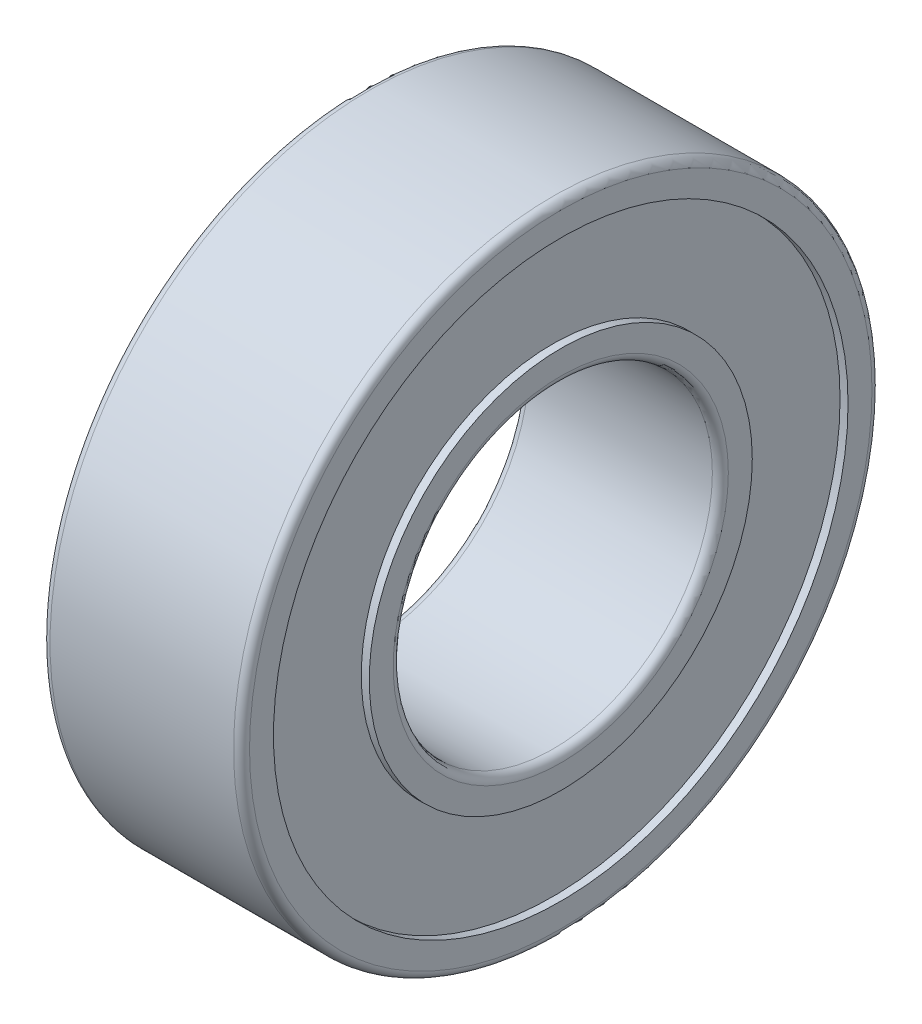
ISO-10303-21;
HEADER;
FILE_DESCRIPTION(('STEP AP214'),'2;1');
FILE_NAME('part.step','',(''),(''),'','','');
FILE_SCHEMA(('AUTOMOTIVE_DESIGN { 1 0 10303 214 1 1 1 1 }'));
ENDSEC;
DATA;
#1=APPLICATION_CONTEXT('core data for automotive mechanical design processes');
#2=APPLICATION_PROTOCOL_DEFINITION('international standard','automotive_design',2000,#1);
#3=PRODUCT_CONTEXT('',#1,'mechanical');
#4=PRODUCT('Part','Part','',(#3));
#5=PRODUCT_RELATED_PRODUCT_CATEGORY('part','',(#4));
#6=PRODUCT_DEFINITION_FORMATION('','',#4);
#7=PRODUCT_DEFINITION_CONTEXT('part definition',#1,'design');
#8=PRODUCT_DEFINITION('design','',#6,#7);
#9=PRODUCT_DEFINITION_SHAPE('','',#8);
#10=(LENGTH_UNIT() NAMED_UNIT(*) SI_UNIT(.MILLI.,.METRE.));
#11=(NAMED_UNIT(*) PLANE_ANGLE_UNIT() SI_UNIT($,.RADIAN.));
#12=(NAMED_UNIT(*) SI_UNIT($,.STERADIAN.) SOLID_ANGLE_UNIT());
#13=UNCERTAINTY_MEASURE_WITH_UNIT(LENGTH_MEASURE(1.E-05),#10,'distance_accuracy_value','');
#14=(GEOMETRIC_REPRESENTATION_CONTEXT(3) GLOBAL_UNCERTAINTY_ASSIGNED_CONTEXT((#13)) GLOBAL_UNIT_ASSIGNED_CONTEXT((#10,
#11,#12)) REPRESENTATION_CONTEXT('',''));
#15=CARTESIAN_POINT('',(0.,0.,0.));
#16=DIRECTION('',(0.,0.,1.));
#17=DIRECTION('',(1.,0.,0.));
#18=AXIS2_PLACEMENT_3D('',#15,#16,#17);
#19=CARTESIAN_POINT('',(50.,0.,0.));
#20=DIRECTION('',(1.,0.,0.));
#21=DIRECTION('',(0.,0.,-1.));
#22=AXIS2_PLACEMENT_3D('',#19,#20,#21);
#23=CYLINDRICAL_SURFACE('',#22,7.2);
#24=CARTESIAN_POINT('',(-4.8,0.,0.));
#25=DIRECTION('',(-1.,0.,0.));
#26=DIRECTION('',(0.,0.,1.));
#27=AXIS2_PLACEMENT_3D('',#24,#25,#26);
#28=CIRCLE('',#27,7.2);
#29=CARTESIAN_POINT('',(-4.8,0.,7.2));
#30=VERTEX_POINT('',#29);
#31=EDGE_CURVE('E5',#30,#30,#28,.T.);
#32=ORIENTED_EDGE('',*,*,#31,.F.);
#33=EDGE_LOOP('',(#32));
#34=FACE_BOUND('',#33,.T.);
#35=CARTESIAN_POINT('',(-5.,0.,0.));
#36=DIRECTION('',(1.,0.,0.));
#37=DIRECTION('',(0.,0.,-1.));
#38=AXIS2_PLACEMENT_3D('',#35,#36,#37);
#39=CIRCLE('',#38,7.2);
#40=CARTESIAN_POINT('',(-5.,0.,-7.2));
#41=VERTEX_POINT('',#40);
#42=EDGE_CURVE('E9',#41,#41,#39,.T.);
#43=ORIENTED_EDGE('',*,*,#42,.F.);
#44=EDGE_LOOP('',(#43));
#45=FACE_BOUND('',#44,.T.);
#46=ADVANCED_FACE('F13',(#34,#45),#23,.F.);
#47=CARTESIAN_POINT('',(50.,0.,0.));
#48=DIRECTION('',(1.,0.,0.));
#49=DIRECTION('',(0.,0.,-1.));
#50=AXIS2_PLACEMENT_3D('',#47,#48,#49);
#51=CYLINDRICAL_SURFACE('',#50,4.8);
#52=CARTESIAN_POINT('',(-4.8,0.,0.));
#53=DIRECTION('',(1.,0.,0.));
#54=DIRECTION('',(0.,0.,1.));
#55=AXIS2_PLACEMENT_3D('',#52,#53,#54);
#56=CIRCLE('',#55,4.8);
#57=CARTESIAN_POINT('',(-4.8,0.,4.8));
#58=VERTEX_POINT('',#57);
#59=EDGE_CURVE('E24',#58,#58,#56,.T.);
#60=ORIENTED_EDGE('',*,*,#59,.F.);
#61=EDGE_LOOP('',(#60));
#62=FACE_BOUND('',#61,.T.);
#63=CARTESIAN_POINT('',(-5.,0.,0.));
#64=DIRECTION('',(1.,0.,0.));
#65=DIRECTION('',(0.,0.,-1.));
#66=AXIS2_PLACEMENT_3D('',#63,#64,#65);
#67=CIRCLE('',#66,4.8);
#68=CARTESIAN_POINT('',(-5.,0.,-4.8));
#69=VERTEX_POINT('',#68);
#70=EDGE_CURVE('E28',#69,#69,#67,.T.);
#71=ORIENTED_EDGE('',*,*,#70,.T.);
#72=EDGE_LOOP('',(#71));
#73=FACE_BOUND('',#72,.T.);
#74=ADVANCED_FACE('F32',(#62,#73),#51,.T.);
#75=CARTESIAN_POINT('',(-5.,7.8,0.));
#76=DIRECTION('',(-1.,0.,0.));
#77=DIRECTION('',(0.,0.,1.));
#78=AXIS2_PLACEMENT_3D('',#75,#76,#77);
#79=PLANE('',#78);
#80=ORIENTED_EDGE('',*,*,#42,.T.);
#81=EDGE_LOOP('',(#80));
#82=FACE_BOUND('',#81,.T.);
#83=CARTESIAN_POINT('',(-5.,0.,0.));
#84=DIRECTION('',(1.,0.,0.));
#85=DIRECTION('',(0.,0.,-1.));
#86=AXIS2_PLACEMENT_3D('',#83,#84,#85);
#87=CIRCLE('',#86,7.7999998908242);
#88=CARTESIAN_POINT('',(-5.,0.,-7.7999998908242));
#89=VERTEX_POINT('',#88);
#90=EDGE_CURVE('E41',#89,#89,#87,.T.);
#91=ORIENTED_EDGE('',*,*,#90,.F.);
#92=EDGE_LOOP('',(#91));
#93=FACE_BOUND('',#92,.T.);
#94=ADVANCED_FACE('F45',(#82,#93),#79,.T.);
#95=CARTESIAN_POINT('',(-5.,4.8,0.));
#96=DIRECTION('',(-1.,0.,0.));
#97=DIRECTION('',(0.,0.,1.));
#98=AXIS2_PLACEMENT_3D('',#95,#96,#97);
#99=PLANE('',#98);
#100=CARTESIAN_POINT('',(-5.,0.,0.));
#101=DIRECTION('',(1.,0.,0.));
#102=DIRECTION('',(0.,0.,-1.));
#103=AXIS2_PLACEMENT_3D('',#100,#101,#102);
#104=CIRCLE('',#103,4.19999988900885);
#105=CARTESIAN_POINT('',(-5.,0.,-4.19999988900885));
#106=VERTEX_POINT('',#105);
#107=EDGE_CURVE('E52',#106,#106,#104,.T.);
#108=ORIENTED_EDGE('',*,*,#107,.T.);
#109=EDGE_LOOP('',(#108));
#110=FACE_BOUND('',#109,.T.);
#111=ORIENTED_EDGE('',*,*,#70,.F.);
#112=EDGE_LOOP('',(#111));
#113=FACE_BOUND('',#112,.T.);
#114=ADVANCED_FACE('F58',(#110,#113),#99,.T.);
#115=CARTESIAN_POINT('',(-4.8,0.,0.));
#116=DIRECTION('',(1.,0.,0.));
#117=DIRECTION('',(0.,0.,-1.));
#118=AXIS2_PLACEMENT_3D('',#115,#116,#117);
#119=TOROIDAL_SURFACE('',#118,4.2,0.200000000000031);
#120=CARTESIAN_POINT('',(-4.8,0.,0.));
#121=DIRECTION('',(1.,0.,0.));
#122=DIRECTION('',(0.,0.,-1.));
#123=AXIS2_PLACEMENT_3D('',#120,#121,#122);
#124=CIRCLE('',#123,4.);
#125=CARTESIAN_POINT('',(-4.8,0.,-4.));
#126=VERTEX_POINT('',#125);
#127=EDGE_CURVE('E65',#126,#126,#124,.T.);
#128=ORIENTED_EDGE('',*,*,#127,.T.);
#129=EDGE_LOOP('',(#128));
#130=FACE_BOUND('',#129,.T.);
#131=ORIENTED_EDGE('',*,*,#107,.F.);
#132=EDGE_LOOP('',(#131));
#133=FACE_BOUND('',#132,.T.);
#134=ADVANCED_FACE('F71',(#130,#133),#119,.T.);
#135=CARTESIAN_POINT('',(50.,0.,0.));
#136=DIRECTION('',(1.,0.,0.));
#137=DIRECTION('',(0.,0.,-1.));
#138=AXIS2_PLACEMENT_3D('',#135,#136,#137);
#139=CYLINDRICAL_SURFACE('',#138,4.);
#140=CARTESIAN_POINT('',(-0.200000000000003,0.,0.));
#141=DIRECTION('',(1.,0.,0.));
#142=DIRECTION('',(0.,0.,-1.));
#143=AXIS2_PLACEMENT_3D('',#140,#141,#142);
#144=CIRCLE('',#143,4.);
#145=CARTESIAN_POINT('',(-0.200000000000003,0.,-4.));
#146=VERTEX_POINT('',#145);
#147=EDGE_CURVE('E78',#146,#146,#144,.T.);
#148=ORIENTED_EDGE('',*,*,#147,.T.);
#149=EDGE_LOOP('',(#148));
#150=FACE_BOUND('',#149,.T.);
#151=ORIENTED_EDGE('',*,*,#127,.F.);
#152=EDGE_LOOP('',(#151));
#153=FACE_BOUND('',#152,.T.);
#154=ADVANCED_FACE('F84',(#150,#153),#139,.F.);
#155=CARTESIAN_POINT('',(-0.200000000000016,0.,0.));
#156=DIRECTION('',(1.,0.,0.));
#157=DIRECTION('',(0.,0.,-1.));
#158=AXIS2_PLACEMENT_3D('',#155,#156,#157);
#159=TOROIDAL_SURFACE('',#158,4.2,0.200000000000016);
#160=CARTESIAN_POINT('',(0.,0.,0.));
#161=DIRECTION('',(1.,0.,0.));
#162=DIRECTION('',(0.,0.,-1.));
#163=AXIS2_PLACEMENT_3D('',#160,#161,#162);
#164=CIRCLE('',#163,4.2);
#165=CARTESIAN_POINT('',(0.,0.,-4.2));
#166=VERTEX_POINT('',#165);
#167=EDGE_CURVE('E91',#166,#166,#164,.T.);
#168=ORIENTED_EDGE('',*,*,#167,.T.);
#169=EDGE_LOOP('',(#168));
#170=FACE_BOUND('',#169,.T.);
#171=ORIENTED_EDGE('',*,*,#147,.F.);
#172=EDGE_LOOP('',(#171));
#173=FACE_BOUND('',#172,.T.);
#174=ADVANCED_FACE('F97',(#170,#173),#159,.T.);
#175=CARTESIAN_POINT('',(0.,4.2,0.));
#176=DIRECTION('',(1.,0.,0.));
#177=DIRECTION('',(0.,0.,-1.));
#178=AXIS2_PLACEMENT_3D('',#175,#176,#177);
#179=PLANE('',#178);
#180=CARTESIAN_POINT('',(0.,0.,0.));
#181=DIRECTION('',(1.,0.,0.));
#182=DIRECTION('',(0.,0.,-1.));
#183=AXIS2_PLACEMENT_3D('',#180,#181,#182);
#184=CIRCLE('',#183,4.8);
#185=CARTESIAN_POINT('',(0.,0.,-4.8));
#186=VERTEX_POINT('',#185);
#187=EDGE_CURVE('E104',#186,#186,#184,.T.);
#188=ORIENTED_EDGE('',*,*,#187,.T.);
#189=EDGE_LOOP('',(#188));
#190=FACE_BOUND('',#189,.T.);
#191=ORIENTED_EDGE('',*,*,#167,.F.);
#192=EDGE_LOOP('',(#191));
#193=FACE_BOUND('',#192,.T.);
#194=ADVANCED_FACE('F110',(#190,#193),#179,.T.);
#195=CARTESIAN_POINT('',(50.,0.,0.));
#196=DIRECTION('',(1.,0.,0.));
#197=DIRECTION('',(0.,0.,-1.));
#198=AXIS2_PLACEMENT_3D('',#195,#196,#197);
#199=CYLINDRICAL_SURFACE('',#198,4.8);
#200=CARTESIAN_POINT('',(-0.200000000000003,0.,0.));
#201=DIRECTION('',(-1.,0.,0.));
#202=DIRECTION('',(0.,0.,-1.));
#203=AXIS2_PLACEMENT_3D('',#200,#201,#202);
#204=CIRCLE('',#203,4.8);
#205=CARTESIAN_POINT('',(-0.200000000000003,0.,-4.8));
#206=VERTEX_POINT('',#205);
#207=EDGE_CURVE('E117',#206,#206,#204,.T.);
#208=ORIENTED_EDGE('',*,*,#207,.F.);
#209=EDGE_LOOP('',(#208));
#210=FACE_BOUND('',#209,.T.);
#211=ORIENTED_EDGE('',*,*,#187,.F.);
#212=EDGE_LOOP('',(#211));
#213=FACE_BOUND('',#212,.T.);
#214=ADVANCED_FACE('F123',(#210,#213),#199,.T.);
#215=CARTESIAN_POINT('',(50.,0.,0.));
#216=DIRECTION('',(1.,0.,0.));
#217=DIRECTION('',(0.,0.,-1.));
#218=AXIS2_PLACEMENT_3D('',#215,#216,#217);
#219=CYLINDRICAL_SURFACE('',#218,7.2);
#220=CARTESIAN_POINT('',(-0.200000000000003,0.,0.));
#221=DIRECTION('',(1.,0.,0.));
#222=DIRECTION('',(0.,0.,-1.));
#223=AXIS2_PLACEMENT_3D('',#220,#221,#222);
#224=CIRCLE('',#223,7.2);
#225=CARTESIAN_POINT('',(-0.200000000000003,0.,-7.2));
#226=VERTEX_POINT('',#225);
#227=EDGE_CURVE('E130',#226,#226,#224,.T.);
#228=ORIENTED_EDGE('',*,*,#227,.F.);
#229=EDGE_LOOP('',(#228));
#230=FACE_BOUND('',#229,.T.);
#231=CARTESIAN_POINT('',(0.,0.,0.));
#232=DIRECTION('',(1.,0.,0.));
#233=DIRECTION('',(0.,0.,-1.));
#234=AXIS2_PLACEMENT_3D('',#231,#232,#233);
#235=CIRCLE('',#234,7.2);
#236=CARTESIAN_POINT('',(0.,0.,-7.2));
#237=VERTEX_POINT('',#236);
#238=EDGE_CURVE('E134',#237,#237,#235,.T.);
#239=ORIENTED_EDGE('',*,*,#238,.T.);
#240=EDGE_LOOP('',(#239));
#241=FACE_BOUND('',#240,.T.);
#242=ADVANCED_FACE('F138',(#230,#241),#219,.F.);
#243=CARTESIAN_POINT('',(0.,7.2,0.));
#244=DIRECTION('',(1.,0.,0.));
#245=DIRECTION('',(0.,0.,-1.));
#246=AXIS2_PLACEMENT_3D('',#243,#244,#245);
#247=PLANE('',#246);
#248=CARTESIAN_POINT('',(0.,0.,0.));
#249=DIRECTION('',(1.,0.,0.));
#250=DIRECTION('',(0.,0.,-1.));
#251=AXIS2_PLACEMENT_3D('',#248,#249,#250);
#252=CIRCLE('',#251,7.8);
#253=CARTESIAN_POINT('',(0.,0.,-7.8));
#254=VERTEX_POINT('',#253);
#255=EDGE_CURVE('E145',#254,#254,#252,.T.);
#256=ORIENTED_EDGE('',*,*,#255,.T.);
#257=EDGE_LOOP('',(#256));
#258=FACE_BOUND('',#257,.T.);
#259=ORIENTED_EDGE('',*,*,#238,.F.);
#260=EDGE_LOOP('',(#259));
#261=FACE_BOUND('',#260,.T.);
#262=ADVANCED_FACE('F151',(#258,#261),#247,.T.);
#263=CARTESIAN_POINT('',(-0.200000000000014,0.,0.));
#264=DIRECTION('',(1.,0.,0.));
#265=DIRECTION('',(0.,0.,-1.));
#266=AXIS2_PLACEMENT_3D('',#263,#264,#265);
#267=TOROIDAL_SURFACE('',#266,7.8,0.200000000000014);
#268=CARTESIAN_POINT('',(-0.2,0.,0.));
#269=DIRECTION('',(1.,0.,0.));
#270=DIRECTION('',(0.,0.,-1.));
#271=AXIS2_PLACEMENT_3D('',#268,#269,#270);
#272=CIRCLE('',#271,8.);
#273=CARTESIAN_POINT('',(-0.2,0.,-8.));
#274=VERTEX_POINT('',#273);
#275=EDGE_CURVE('E158',#274,#274,#272,.T.);
#276=ORIENTED_EDGE('',*,*,#275,.T.);
#277=EDGE_LOOP('',(#276));
#278=FACE_BOUND('',#277,.T.);
#279=ORIENTED_EDGE('',*,*,#255,.F.);
#280=EDGE_LOOP('',(#279));
#281=FACE_BOUND('',#280,.T.);
#282=ADVANCED_FACE('F164',(#278,#281),#267,.T.);
#283=CARTESIAN_POINT('',(50.,0.,0.));
#284=DIRECTION('',(1.,0.,0.));
#285=DIRECTION('',(0.,0.,-1.));
#286=AXIS2_PLACEMENT_3D('',#283,#284,#285);
#287=CYLINDRICAL_SURFACE('',#286,8.);
#288=CARTESIAN_POINT('',(-4.8,0.,0.));
#289=DIRECTION('',(1.,0.,0.));
#290=DIRECTION('',(0.,0.,-1.));
#291=AXIS2_PLACEMENT_3D('',#288,#289,#290);
#292=CIRCLE('',#291,8.);
#293=CARTESIAN_POINT('',(-4.8,0.,-8.));
#294=VERTEX_POINT('',#293);
#295=EDGE_CURVE('E171',#294,#294,#292,.T.);
#296=ORIENTED_EDGE('',*,*,#295,.T.);
#297=EDGE_LOOP('',(#296));
#298=FACE_BOUND('',#297,.T.);
#299=ORIENTED_EDGE('',*,*,#275,.F.);
#300=EDGE_LOOP('',(#299));
#301=FACE_BOUND('',#300,.T.);
#302=ADVANCED_FACE('F177',(#298,#301),#287,.T.);
#303=CARTESIAN_POINT('',(-4.8,0.,0.));
#304=DIRECTION('',(1.,0.,0.));
#305=DIRECTION('',(0.,0.,-1.));
#306=AXIS2_PLACEMENT_3D('',#303,#304,#305);
#307=TOROIDAL_SURFACE('',#306,7.8,0.20000000000003);
#308=ORIENTED_EDGE('',*,*,#90,.T.);
#309=EDGE_LOOP('',(#308));
#310=FACE_BOUND('',#309,.T.);
#311=ORIENTED_EDGE('',*,*,#295,.F.);
#312=EDGE_LOOP('',(#311));
#313=FACE_BOUND('',#312,.T.);
#314=ADVANCED_FACE('F188',(#310,#313),#307,.T.);
#315=CARTESIAN_POINT('',(-4.8,7.2,0.));
#316=DIRECTION('',(-1.,0.,0.));
#317=DIRECTION('',(0.,0.,1.));
#318=AXIS2_PLACEMENT_3D('',#315,#316,#317);
#319=PLANE('',#318);
#320=ORIENTED_EDGE('',*,*,#59,.T.);
#321=EDGE_LOOP('',(#320));
#322=FACE_BOUND('',#321,.T.);
#323=ORIENTED_EDGE('',*,*,#31,.T.);
#324=EDGE_LOOP('',(#323));
#325=FACE_BOUND('',#324,.T.);
#326=ADVANCED_FACE('F199',(#322,#325),#319,.T.);
#327=CARTESIAN_POINT('',(-0.2,4.8,0.));
#328=DIRECTION('',(1.,0.,0.));
#329=DIRECTION('',(0.,0.,-1.));
#330=AXIS2_PLACEMENT_3D('',#327,#328,#329);
#331=PLANE('',#330);
#332=ORIENTED_EDGE('',*,*,#227,.T.);
#333=EDGE_LOOP('',(#332));
#334=FACE_BOUND('',#333,.T.);
#335=ORIENTED_EDGE('',*,*,#207,.T.);
#336=EDGE_LOOP('',(#335));
#337=FACE_BOUND('',#336,.T.);
#338=ADVANCED_FACE('F210',(#334,#337),#331,.T.);
#339=CLOSED_SHELL('',(#46,#74,#94,#114,#134,#154,#174,#194,#214,#242,#262,#282,#302,#314,#326,#338));
#340=CARTESIAN_POINT('',(-4.6,4.8,0.));
#341=DIRECTION('',(1.,0.,0.));
#342=DIRECTION('',(0.,0.,-1.));
#343=AXIS2_PLACEMENT_3D('',#340,#341,#342);
#344=PLANE('',#343);
#345=CARTESIAN_POINT('',(-4.6,0.,0.));
#346=DIRECTION('',(1.,0.,0.));
#347=DIRECTION('',(0.,0.,-1.));
#348=AXIS2_PLACEMENT_3D('',#345,#346,#347);
#349=CIRCLE('',#348,7.2);
#350=CARTESIAN_POINT('',(-4.6,0.,-7.2));
#351=VERTEX_POINT('',#350);
#352=EDGE_CURVE('E218',#351,#351,#349,.T.);
#353=ORIENTED_EDGE('',*,*,#352,.T.);
#354=EDGE_LOOP('',(#353));
#355=FACE_BOUND('',#354,.T.);
#356=CARTESIAN_POINT('',(-4.6,0.,0.));
#357=DIRECTION('',(-1.,0.,0.));
#358=DIRECTION('',(0.,0.,-1.));
#359=AXIS2_PLACEMENT_3D('',#356,#357,#358);
#360=CIRCLE('',#359,4.8);
#361=CARTESIAN_POINT('',(-4.6,0.,-4.8));
#362=VERTEX_POINT('',#361);
#363=EDGE_CURVE('E222',#362,#362,#360,.T.);
#364=ORIENTED_EDGE('',*,*,#363,.T.);
#365=EDGE_LOOP('',(#364));
#366=FACE_BOUND('',#365,.T.);
#367=ADVANCED_FACE('F226',(#355,#366),#344,.T.);
#368=CARTESIAN_POINT('',(50.,0.,0.));
#369=DIRECTION('',(1.,0.,0.));
#370=DIRECTION('',(0.,0.,-1.));
#371=AXIS2_PLACEMENT_3D('',#368,#369,#370);
#372=CYLINDRICAL_SURFACE('',#371,7.2);
#373=ORIENTED_EDGE('',*,*,#352,.F.);
#374=EDGE_LOOP('',(#373));
#375=FACE_BOUND('',#374,.T.);
#376=CARTESIAN_POINT('',(-3.2211102550928,0.,0.));
#377=DIRECTION('',(1.,0.,0.));
#378=DIRECTION('',(0.,0.,-1.));
#379=AXIS2_PLACEMENT_3D('',#376,#377,#378);
#380=CIRCLE('',#379,7.2);
#381=CARTESIAN_POINT('',(-3.2211102550928,0.,-7.2));
#382=VERTEX_POINT('',#381);
#383=EDGE_CURVE('E235',#382,#382,#380,.T.);
#384=ORIENTED_EDGE('',*,*,#383,.T.);
#385=EDGE_LOOP('',(#384));
#386=FACE_BOUND('',#385,.T.);
#387=ADVANCED_FACE('F239',(#375,#386),#372,.F.);
#388=CARTESIAN_POINT('',(-2.5,0.,0.));
#389=DIRECTION('',(1.,0.,0.));
#390=DIRECTION('',(0.,0.,-1.));
#391=AXIS2_PLACEMENT_3D('',#388,#389,#390);
#392=TOROIDAL_SURFACE('',#391,6.,1.4);
#393=CARTESIAN_POINT('',(-3.2211102550928,0.,0.));
#394=DIRECTION('',(1.,0.,0.));
#395=DIRECTION('',(0.,0.,-1.));
#396=AXIS2_PLACEMENT_3D('',#393,#394,#395);
#397=CIRCLE('',#396,4.8);
#398=CARTESIAN_POINT('',(-3.2211102550928,0.,-4.8));
#399=VERTEX_POINT('',#398);
#400=EDGE_CURVE('E246',#399,#399,#397,.T.);
#401=ORIENTED_EDGE('',*,*,#400,.T.);
#402=EDGE_LOOP('',(#401));
#403=FACE_BOUND('',#402,.T.);
#404=ORIENTED_EDGE('',*,*,#383,.F.);
#405=EDGE_LOOP('',(#404));
#406=FACE_BOUND('',#405,.T.);
#407=ADVANCED_FACE('F252',(#403,#406),#392,.T.);
#408=CARTESIAN_POINT('',(50.,0.,0.));
#409=DIRECTION('',(1.,0.,0.));
#410=DIRECTION('',(0.,0.,-1.));
#411=AXIS2_PLACEMENT_3D('',#408,#409,#410);
#412=CYLINDRICAL_SURFACE('',#411,4.8);
#413=ORIENTED_EDGE('',*,*,#363,.F.);
#414=EDGE_LOOP('',(#413));
#415=FACE_BOUND('',#414,.T.);
#416=ORIENTED_EDGE('',*,*,#400,.F.);
#417=EDGE_LOOP('',(#416));
#418=FACE_BOUND('',#417,.T.);
#419=ADVANCED_FACE('F263',(#415,#418),#412,.T.);
#420=CLOSED_SHELL('',(#367,#387,#407,#419));
#421=CARTESIAN_POINT('',(-0.4,7.2,0.));
#422=DIRECTION('',(-1.,0.,0.));
#423=DIRECTION('',(0.,0.,1.));
#424=AXIS2_PLACEMENT_3D('',#421,#422,#423);
#425=PLANE('',#424);
#426=CARTESIAN_POINT('',(-0.399999999999999,0.,0.));
#427=DIRECTION('',(1.,0.,0.));
#428=DIRECTION('',(0.,0.,1.));
#429=AXIS2_PLACEMENT_3D('',#426,#427,#428);
#430=CIRCLE('',#429,4.8);
#431=CARTESIAN_POINT('',(-0.399999999999999,0.,4.8));
#432=VERTEX_POINT('',#431);
#433=EDGE_CURVE('E271',#432,#432,#430,.T.);
#434=ORIENTED_EDGE('',*,*,#433,.T.);
#435=EDGE_LOOP('',(#434));
#436=FACE_BOUND('',#435,.T.);
#437=CARTESIAN_POINT('',(-0.399999999999999,0.,0.));
#438=DIRECTION('',(-1.,0.,0.));
#439=DIRECTION('',(0.,0.,1.));
#440=AXIS2_PLACEMENT_3D('',#437,#438,#439);
#441=CIRCLE('',#440,7.2);
#442=CARTESIAN_POINT('',(-0.399999999999999,0.,7.2));
#443=VERTEX_POINT('',#442);
#444=EDGE_CURVE('E275',#443,#443,#441,.T.);
#445=ORIENTED_EDGE('',*,*,#444,.T.);
#446=EDGE_LOOP('',(#445));
#447=FACE_BOUND('',#446,.T.);
#448=ADVANCED_FACE('F279',(#436,#447),#425,.T.);
#449=CARTESIAN_POINT('',(50.,0.,0.));
#450=DIRECTION('',(1.,0.,0.));
#451=DIRECTION('',(0.,0.,-1.));
#452=AXIS2_PLACEMENT_3D('',#449,#450,#451);
#453=CYLINDRICAL_SURFACE('',#452,4.8);
#454=ORIENTED_EDGE('',*,*,#433,.F.);
#455=EDGE_LOOP('',(#454));
#456=FACE_BOUND('',#455,.T.);
#457=CARTESIAN_POINT('',(-1.7788897449072,0.,0.));
#458=DIRECTION('',(1.,0.,0.));
#459=DIRECTION('',(0.,0.,-1.));
#460=AXIS2_PLACEMENT_3D('',#457,#458,#459);
#461=CIRCLE('',#460,4.8);
#462=CARTESIAN_POINT('',(-1.7788897449072,0.,-4.8));
#463=VERTEX_POINT('',#462);
#464=EDGE_CURVE('E288',#463,#463,#461,.T.);
#465=ORIENTED_EDGE('',*,*,#464,.T.);
#466=EDGE_LOOP('',(#465));
#467=FACE_BOUND('',#466,.T.);
#468=ADVANCED_FACE('F292',(#456,#467),#453,.T.);
#469=CARTESIAN_POINT('',(-2.5,0.,0.));
#470=DIRECTION('',(1.,0.,0.));
#471=DIRECTION('',(0.,0.,-1.));
#472=AXIS2_PLACEMENT_3D('',#469,#470,#471);
#473=TOROIDAL_SURFACE('',#472,6.,1.4);
#474=CARTESIAN_POINT('',(-1.77888974490719,0.,0.));
#475=DIRECTION('',(1.,0.,0.));
#476=DIRECTION('',(0.,0.,-1.));
#477=AXIS2_PLACEMENT_3D('',#474,#475,#476);
#478=CIRCLE('',#477,7.2);
#479=CARTESIAN_POINT('',(-1.77888974490719,0.,-7.2));
#480=VERTEX_POINT('',#479);
#481=EDGE_CURVE('E299',#480,#480,#478,.T.);
#482=ORIENTED_EDGE('',*,*,#481,.T.);
#483=EDGE_LOOP('',(#482));
#484=FACE_BOUND('',#483,.T.);
#485=ORIENTED_EDGE('',*,*,#464,.F.);
#486=EDGE_LOOP('',(#485));
#487=FACE_BOUND('',#486,.T.);
#488=ADVANCED_FACE('F305',(#484,#487),#473,.T.);
#489=CARTESIAN_POINT('',(50.,0.,0.));
#490=DIRECTION('',(1.,0.,0.));
#491=DIRECTION('',(0.,0.,-1.));
#492=AXIS2_PLACEMENT_3D('',#489,#490,#491);
#493=CYLINDRICAL_SURFACE('',#492,7.2);
#494=ORIENTED_EDGE('',*,*,#444,.F.);
#495=EDGE_LOOP('',(#494));
#496=FACE_BOUND('',#495,.T.);
#497=ORIENTED_EDGE('',*,*,#481,.F.);
#498=EDGE_LOOP('',(#497));
#499=FACE_BOUND('',#498,.T.);
#500=ADVANCED_FACE('F316',(#496,#499),#493,.F.);
#501=CLOSED_SHELL('',(#448,#468,#488,#500));
#502=ORIENTED_CLOSED_SHELL('',*,#420,.T.);
#503=ORIENTED_CLOSED_SHELL('',*,#501,.T.);
#504=BREP_WITH_VOIDS('B1',#339,(#502,#503));
#505=ADVANCED_BREP_SHAPE_REPRESENTATION('',(#18,#504),#14);
#506=SHAPE_DEFINITION_REPRESENTATION(#9,#505);
ENDSEC;
END-ISO-10303-21;
